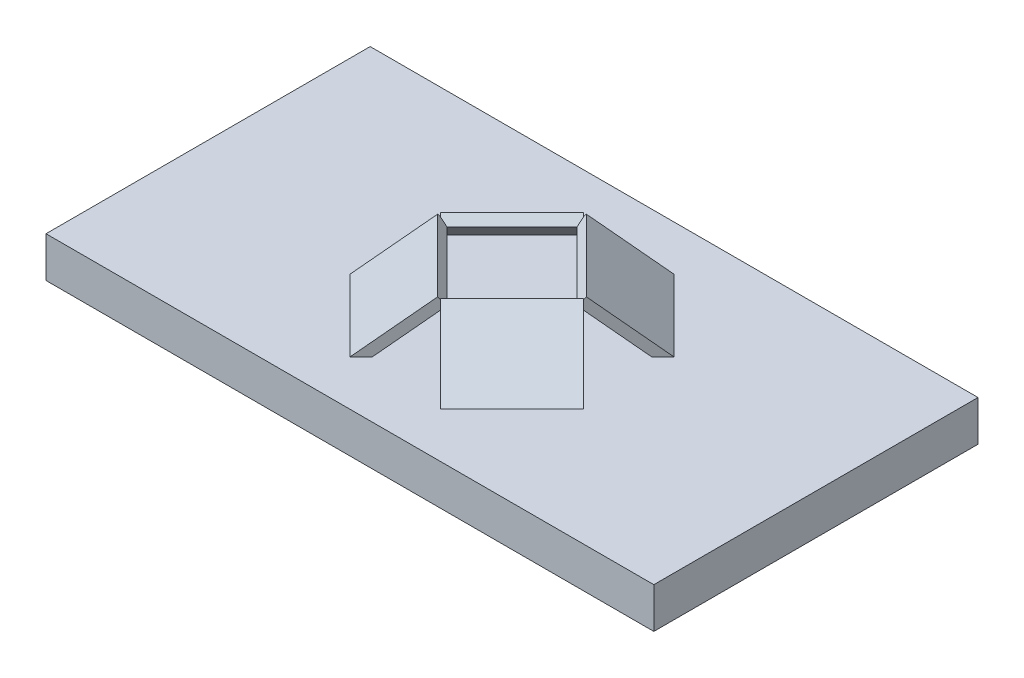
ISO-10303-21;
HEADER;
FILE_DESCRIPTION(('STEP AP214'),'2;1');
FILE_NAME('part.step','',(''),(''),'','','');
FILE_SCHEMA(('AUTOMOTIVE_DESIGN { 1 0 10303 214 1 1 1 1 }'));
ENDSEC;
DATA;
#1=APPLICATION_CONTEXT('core data for automotive mechanical design processes');
#2=APPLICATION_PROTOCOL_DEFINITION('international standard','automotive_design',2000,#1);
#3=PRODUCT_CONTEXT('',#1,'mechanical');
#4=PRODUCT('Part','Part','',(#3));
#5=PRODUCT_RELATED_PRODUCT_CATEGORY('part','',(#4));
#6=PRODUCT_DEFINITION_FORMATION('','',#4);
#7=PRODUCT_DEFINITION_CONTEXT('part definition',#1,'design');
#8=PRODUCT_DEFINITION('design','',#6,#7);
#9=PRODUCT_DEFINITION_SHAPE('','',#8);
#10=(LENGTH_UNIT() NAMED_UNIT(*) SI_UNIT(.MILLI.,.METRE.));
#11=(NAMED_UNIT(*) PLANE_ANGLE_UNIT() SI_UNIT($,.RADIAN.));
#12=(NAMED_UNIT(*) SI_UNIT($,.STERADIAN.) SOLID_ANGLE_UNIT());
#13=UNCERTAINTY_MEASURE_WITH_UNIT(LENGTH_MEASURE(1.E-05),#10,'distance_accuracy_value','');
#14=(GEOMETRIC_REPRESENTATION_CONTEXT(3) GLOBAL_UNCERTAINTY_ASSIGNED_CONTEXT((#13)) GLOBAL_UNIT_ASSIGNED_CONTEXT((#10,
#11,#12)) REPRESENTATION_CONTEXT('',''));
#15=CARTESIAN_POINT('',(0.,0.,0.));
#16=DIRECTION('',(0.,0.,1.));
#17=DIRECTION('',(1.,0.,0.));
#18=AXIS2_PLACEMENT_3D('',#15,#16,#17);
#19=CARTESIAN_POINT('',(0.,2.,0.));
#20=DIRECTION('',(0.,1.,0.));
#21=DIRECTION('',(0.,0.,1.));
#22=AXIS2_PLACEMENT_3D('',#19,#20,#21);
#23=PLANE('',#22);
#24=DIRECTION('',(1.,0.,0.));
#25=VECTOR('',#24,1.);
#26=CARTESIAN_POINT('',(-15.,2.,8.));
#27=LINE('',#26,#25);
#28=CARTESIAN_POINT('',(-15.,2.,8.));
#29=VERTEX_POINT('',#28);
#30=CARTESIAN_POINT('',(15.,2.,8.));
#31=VERTEX_POINT('',#30);
#32=EDGE_CURVE('E367',#29,#31,#27,.T.);
#33=ORIENTED_EDGE('',*,*,#32,.T.);
#34=DIRECTION('',(0.,0.,-1.));
#35=VECTOR('',#34,1.);
#36=CARTESIAN_POINT('',(15.,2.,8.));
#37=LINE('',#36,#35);
#38=CARTESIAN_POINT('',(15.,2.,-8.));
#39=VERTEX_POINT('',#38);
#40=EDGE_CURVE('E371',#31,#39,#37,.T.);
#41=ORIENTED_EDGE('',*,*,#40,.T.);
#42=DIRECTION('',(1.,0.,0.));
#43=VECTOR('',#42,1.);
#44=CARTESIAN_POINT('',(-15.,2.,-8.));
#45=LINE('',#44,#43);
#46=CARTESIAN_POINT('',(-15.,2.,-8.));
#47=VERTEX_POINT('',#46);
#48=EDGE_CURVE('E375',#47,#39,#45,.T.);
#49=ORIENTED_EDGE('',*,*,#48,.F.);
#50=DIRECTION('',(0.,0.,-1.));
#51=VECTOR('',#50,1.);
#52=CARTESIAN_POINT('',(-15.,2.,8.));
#53=LINE('',#52,#51);
#54=EDGE_CURVE('E379',#29,#47,#53,.T.);
#55=ORIENTED_EDGE('',*,*,#54,.F.);
#56=EDGE_LOOP('',(#33,#41,#49,#55));
#57=FACE_BOUND('',#56,.T.);
#58=DIRECTION('',(0.707106781186548,0.,0.707106781186547));
#59=VECTOR('',#58,1.);
#60=CARTESIAN_POINT('',(-3.44996856618676,2.,3.44996856618676));
#61=LINE('',#60,#59);
#62=CARTESIAN_POINT('',(-5.21773551915313,2.,1.68220161322039));
#63=VERTEX_POINT('',#62);
#64=CARTESIAN_POINT('',(-1.68220161322039,2.,5.21773551915313));
#65=VERTEX_POINT('',#64);
#66=EDGE_CURVE('E413',#63,#65,#61,.T.);
#67=ORIENTED_EDGE('',*,*,#66,.T.);
#68=DIRECTION('',(-0.707106781186547,0.,0.707106781186548));
#69=VECTOR('',#68,1.);
#70=CARTESIAN_POINT('',(1.76776695296637,2.,1.76776695296637));
#71=LINE('',#70,#69);
#72=CARTESIAN_POINT('',(-2.23223304703363,2.,5.76776695296637));
#73=VERTEX_POINT('',#72);
#74=EDGE_CURVE('E417',#65,#73,#71,.T.);
#75=ORIENTED_EDGE('',*,*,#74,.T.);
#76=DIRECTION('',(-0.707106781186548,0.,-0.707106781186547));
#77=VECTOR('',#76,1.);
#78=CARTESIAN_POINT('',(-2.23223304703363,2.,5.76776695296637));
#79=LINE('',#78,#77);
#80=CARTESIAN_POINT('',(-5.76776695296637,2.,2.23223304703363));
#81=VERTEX_POINT('',#80);
#82=EDGE_CURVE('E351',#73,#81,#79,.T.);
#83=ORIENTED_EDGE('',*,*,#82,.T.);
#84=DIRECTION('',(0.707106781186547,0.,-0.707106781186548));
#85=VECTOR('',#84,1.);
#86=CARTESIAN_POINT('',(-1.76776695296637,2.,-1.76776695296637));
#87=LINE('',#86,#85);
#88=EDGE_CURVE('E410',#81,#63,#87,.T.);
#89=ORIENTED_EDGE('',*,*,#88,.T.);
#90=EDGE_LOOP('',(#67,#75,#83,#89));
#91=FACE_BOUND('',#90,.T.);
#92=DIRECTION('',(0.70710678118654,0.,-0.707106781186555));
#93=VECTOR('',#92,1.);
#94=CARTESIAN_POINT('',(-5.7677669529664,2.,-2.23223304703357));
#95=LINE('',#94,#93);
#96=CARTESIAN_POINT('',(-5.7677669529664,2.,-2.23223304703357));
#97=VERTEX_POINT('',#96);
#98=CARTESIAN_POINT('',(-2.2322330470337,2.,-5.76776695296635));
#99=VERTEX_POINT('',#98);
#100=EDGE_CURVE('E194',#97,#99,#95,.T.);
#101=ORIENTED_EDGE('',*,*,#100,.T.);
#102=DIRECTION('',(0.707106781186555,0.,0.70710678118654));
#103=VECTOR('',#102,1.);
#104=CARTESIAN_POINT('',(1.76776695296635,2.,-1.76776695296639));
#105=LINE('',#104,#103);
#106=CARTESIAN_POINT('',(-1.68220161322045,2.,-5.21773551915311));
#107=VERTEX_POINT('',#106);
#108=EDGE_CURVE('E436',#99,#107,#105,.T.);
#109=ORIENTED_EDGE('',*,*,#108,.T.);
#110=DIRECTION('',(-0.70710678118654,0.,0.707106781186555));
#111=VECTOR('',#110,1.);
#112=CARTESIAN_POINT('',(-3.4499685661868,2.,-3.44996856618672));
#113=LINE('',#112,#111);
#114=CARTESIAN_POINT('',(-5.21773551915315,2.,-1.68220161322034));
#115=VERTEX_POINT('',#114);
#116=EDGE_CURVE('E197',#107,#115,#113,.T.);
#117=ORIENTED_EDGE('',*,*,#116,.T.);
#118=DIRECTION('',(-0.707106781186555,0.,-0.70710678118654));
#119=VECTOR('',#118,1.);
#120=CARTESIAN_POINT('',(-1.76776695296635,2.,1.76776695296639));
#121=LINE('',#120,#119);
#122=EDGE_CURVE('E191',#115,#97,#121,.T.);
#123=ORIENTED_EDGE('',*,*,#122,.T.);
#124=EDGE_LOOP('',(#101,#109,#117,#123));
#125=FACE_BOUND('',#124,.T.);
#126=DIRECTION('',(-0.707106781186547,0.,0.707106781186548));
#127=VECTOR('',#126,1.);
#128=CARTESIAN_POINT('',(1.76776695296637,2.,1.76776695296637));
#129=LINE('',#128,#127);
#130=CARTESIAN_POINT('',(5.76776695296637,2.,-2.23223304703363));
#131=VERTEX_POINT('',#130);
#132=CARTESIAN_POINT('',(5.21773551915313,2.,-1.68220161322039));
#133=VERTEX_POINT('',#132);
#134=EDGE_CURVE('E442',#131,#133,#129,.T.);
#135=ORIENTED_EDGE('',*,*,#134,.T.);
#136=DIRECTION('',(-0.707106781186548,0.,-0.707106781186547));
#137=VECTOR('',#136,1.);
#138=CARTESIAN_POINT('',(3.44996856618676,2.,-3.44996856618676));
#139=LINE('',#138,#137);
#140=CARTESIAN_POINT('',(1.68220161322039,2.,-5.21773551915313));
#141=VERTEX_POINT('',#140);
#142=EDGE_CURVE('E54',#133,#141,#139,.T.);
#143=ORIENTED_EDGE('',*,*,#142,.T.);
#144=DIRECTION('',(0.707106781186547,0.,-0.707106781186548));
#145=VECTOR('',#144,1.);
#146=CARTESIAN_POINT('',(-1.76776695296637,2.,-1.76776695296637));
#147=LINE('',#146,#145);
#148=CARTESIAN_POINT('',(2.23223304703363,2.,-5.76776695296637));
#149=VERTEX_POINT('',#148);
#150=EDGE_CURVE('E439',#141,#149,#147,.T.);
#151=ORIENTED_EDGE('',*,*,#150,.T.);
#152=DIRECTION('',(0.707106781186548,0.,0.707106781186547));
#153=VECTOR('',#152,1.);
#154=CARTESIAN_POINT('',(2.23223304703363,2.,-5.76776695296637));
#155=LINE('',#154,#153);
#156=EDGE_CURVE('E257',#149,#131,#155,.T.);
#157=ORIENTED_EDGE('',*,*,#156,.T.);
#158=EDGE_LOOP('',(#135,#143,#151,#157));
#159=FACE_BOUND('',#158,.T.);
#160=DIRECTION('',(0.707106781186545,0.,-0.70710678118655));
#161=VECTOR('',#160,1.);
#162=CARTESIAN_POINT('',(3.44996856618678,2.,3.44996856618675));
#163=LINE('',#162,#161);
#164=CARTESIAN_POINT('',(1.68220161322041,2.,5.21773551915313));
#165=VERTEX_POINT('',#164);
#166=CARTESIAN_POINT('',(5.21773551915314,2.,1.68220161322037));
#167=VERTEX_POINT('',#166);
#168=EDGE_CURVE('E60',#165,#167,#163,.T.);
#169=ORIENTED_EDGE('',*,*,#168,.T.);
#170=DIRECTION('',(0.707106781186551,0.,0.707106781186545));
#171=VECTOR('',#170,1.);
#172=CARTESIAN_POINT('',(1.76776695296636,2.,-1.76776695296638));
#173=LINE('',#172,#171);
#174=CARTESIAN_POINT('',(5.76776695296638,2.,2.23223304703361));
#175=VERTEX_POINT('',#174);
#176=EDGE_CURVE('E11',#167,#175,#173,.T.);
#177=ORIENTED_EDGE('',*,*,#176,.T.);
#178=DIRECTION('',(-0.707106781186545,0.,0.70710678118655));
#179=VECTOR('',#178,1.);
#180=CARTESIAN_POINT('',(5.76776695296638,2.,2.23223304703361));
#181=LINE('',#180,#179);
#182=CARTESIAN_POINT('',(2.23223304703365,2.,5.76776695296636));
#183=VERTEX_POINT('',#182);
#184=EDGE_CURVE('E301',#175,#183,#181,.T.);
#185=ORIENTED_EDGE('',*,*,#184,.T.);
#186=DIRECTION('',(-0.70710678118655,0.,-0.707106781186545));
#187=VECTOR('',#186,1.);
#188=CARTESIAN_POINT('',(-1.76776695296636,2.,1.76776695296637));
#189=LINE('',#188,#187);
#190=EDGE_CURVE('E65',#183,#165,#189,.T.);
#191=ORIENTED_EDGE('',*,*,#190,.T.);
#192=EDGE_LOOP('',(#169,#177,#185,#191));
#193=FACE_BOUND('',#192,.T.);
#194=ADVANCED_FACE('F45',(#57,#91,#125,#159,#193),#23,.T.);
#195=CARTESIAN_POINT('',(-2.00497330819761,1.61697777844051,5.54050721413035));
#196=DIRECTION('',(-0.707106781186548,0.,-0.707106781186547));
#197=DIRECTION('',(-0.707106781186547,0.,0.707106781186548));
#198=AXIS2_PLACEMENT_3D('',#195,#196,#197);
#199=PLANE('',#198);
#200=DIRECTION('',(0.,-1.,0.));
#201=VECTOR('',#200,1.);
#202=CARTESIAN_POINT('',(0.,1.61697777844051,3.53553390593273));
#203=LINE('',#202,#201);
#204=CARTESIAN_POINT('',(0.,4.46070291431279,3.53553390593273));
#205=VERTEX_POINT('',#204);
#206=CARTESIAN_POINT('',(0.,3.99621159176338,3.53553390593273));
#207=VERTEX_POINT('',#206);
#208=EDGE_CURVE('E328',#205,#207,#203,.T.);
#209=ORIENTED_EDGE('',*,*,#208,.F.);
#210=DIRECTION('',(-0.454519477672046,0.766044443118975,0.454519477672047));
#211=VECTOR('',#210,1.);
#212=CARTESIAN_POINT('',(0.16172757348119,4.18812821718668,3.37380633245155));
#213=LINE('',#212,#211);
#214=CARTESIAN_POINT('',(-0.0655321653548328,4.57115043874617,3.60106607128757));
#215=VERTEX_POINT('',#214);
#216=EDGE_CURVE('E347',#205,#215,#213,.T.);
#217=ORIENTED_EDGE('',*,*,#216,.T.);
#218=DIRECTION('',(-0.541675220419699,-0.642787609686543,0.5416752204197));
#219=VECTOR('',#218,1.);
#220=CARTESIAN_POINT('',(-2.23223304703363,2.,5.76776695296637));
#221=LINE('',#220,#219);
#222=EDGE_CURVE('E336',#215,#73,#221,.T.);
#223=ORIENTED_EDGE('',*,*,#222,.T.);
#224=ORIENTED_EDGE('',*,*,#74,.F.);
#225=DIRECTION('',(-0.541675220419699,-0.642787609686543,0.5416752204197));
#226=VECTOR('',#225,1.);
#227=CARTESIAN_POINT('',(-2.00497330819761,1.61697777844051,5.54050721413035));
#228=LINE('',#227,#226);
#229=EDGE_CURVE('E337',#207,#65,#228,.T.);
#230=ORIENTED_EDGE('',*,*,#229,.F.);
#231=EDGE_LOOP('',(#209,#217,#223,#224,#230));
#232=FACE_BOUND('',#231,.T.);
#233=ADVANCED_FACE('F519',(#232),#199,.F.);
#234=CARTESIAN_POINT('',(-5.54050721413035,1.61697777844051,2.00497330819761));
#235=DIRECTION('',(0.707106781186548,0.,0.707106781186547));
#236=DIRECTION('',(0.707106781186547,0.,-0.707106781186548));
#237=AXIS2_PLACEMENT_3D('',#234,#235,#236);
#238=PLANE('',#237);
#239=DIRECTION('',(0.,1.,0.));
#240=VECTOR('',#239,1.);
#241=CARTESIAN_POINT('',(-3.53553390593276,1.61697777844051,0.));
#242=LINE('',#241,#240);
#243=CARTESIAN_POINT('',(-3.53553390593276,3.99621159176335,0.));
#244=VERTEX_POINT('',#243);
#245=CARTESIAN_POINT('',(-3.53553390593276,4.46070291431283,0.));
#246=VERTEX_POINT('',#245);
#247=EDGE_CURVE('E203',#244,#246,#242,.T.);
#248=ORIENTED_EDGE('',*,*,#247,.F.);
#249=DIRECTION('',(0.5416752204197,0.642787609686543,-0.541675220419699));
#250=VECTOR('',#249,1.);
#251=CARTESIAN_POINT('',(-5.54050721413035,1.61697777844051,2.00497330819761));
#252=LINE('',#251,#250);
#253=EDGE_CURVE('E340',#63,#244,#252,.T.);
#254=ORIENTED_EDGE('',*,*,#253,.F.);
#255=ORIENTED_EDGE('',*,*,#88,.F.);
#256=DIRECTION('',(0.5416752204197,0.642787609686543,-0.541675220419699));
#257=VECTOR('',#256,1.);
#258=CARTESIAN_POINT('',(-5.76776695296637,2.,2.23223304703364));
#259=LINE('',#258,#257);
#260=CARTESIAN_POINT('',(-3.60106607128757,4.57115043874617,0.0655321653548376));
#261=VERTEX_POINT('',#260);
#262=EDGE_CURVE('E354',#81,#261,#259,.T.);
#263=ORIENTED_EDGE('',*,*,#262,.T.);
#264=DIRECTION('',(-0.454519477672046,0.766044443118975,0.454519477672047));
#265=VECTOR('',#264,1.);
#266=CARTESIAN_POINT('',(-3.37380633245155,4.18812821718668,-0.161727573481186));
#267=LINE('',#266,#265);
#268=EDGE_CURVE('E363',#246,#261,#267,.T.);
#269=ORIENTED_EDGE('',*,*,#268,.F.);
#270=EDGE_LOOP('',(#248,#254,#255,#263,#269));
#271=FACE_BOUND('',#270,.T.);
#272=ADVANCED_FACE('F527',(#271),#238,.F.);
#273=CARTESIAN_POINT('',(0.16172757348119,4.18812821718668,3.37380633245155));
#274=DIRECTION('',(-0.541675220419699,-0.642787609686543,0.5416752204197));
#275=DIRECTION('',(0.,-0.644400477571768,-0.764688187763664));
#276=AXIS2_PLACEMENT_3D('',#273,#274,#275);
#277=PLANE('',#276);
#278=DIRECTION('',(0.,0.644400477571767,0.764688187763665));
#279=VECTOR('',#278,1.);
#280=CARTESIAN_POINT('',(0.,4.26782197502399,3.30664863807152));
#281=LINE('',#280,#279);
#282=CARTESIAN_POINT('',(0.,4.18812821718668,3.21207875897037));
#283=VERTEX_POINT('',#282);
#284=EDGE_CURVE('E432',#283,#205,#281,.T.);
#285=ORIENTED_EDGE('',*,*,#284,.F.);
#286=DIRECTION('',(0.707106781186548,0.,0.707106781186547));
#287=VECTOR('',#286,1.);
#288=CARTESIAN_POINT('',(0.16172757348119,4.18812821718668,3.37380633245155));
#289=LINE('',#288,#287);
#290=CARTESIAN_POINT('',(-3.21207875897035,4.18812821718668,0.));
#291=VERTEX_POINT('',#290);
#292=EDGE_CURVE('E344',#291,#283,#289,.T.);
#293=ORIENTED_EDGE('',*,*,#292,.F.);
#294=DIRECTION('',(0.764688187763663,-0.64440047757177,0.));
#295=VECTOR('',#294,1.);
#296=CARTESIAN_POINT('',(-1.23925217100593,2.5256330776077,0.));
#297=LINE('',#296,#295);
#298=EDGE_CURVE('E428',#246,#291,#297,.T.);
#299=ORIENTED_EDGE('',*,*,#298,.F.);
#300=ORIENTED_EDGE('',*,*,#268,.T.);
#301=DIRECTION('',(0.707106781186548,0.,0.707106781186547));
#302=VECTOR('',#301,1.);
#303=CARTESIAN_POINT('',(-0.0655321653548328,4.57115043874617,3.60106607128757));
#304=LINE('',#303,#302);
#305=EDGE_CURVE('E341',#261,#215,#304,.T.);
#306=ORIENTED_EDGE('',*,*,#305,.T.);
#307=ORIENTED_EDGE('',*,*,#216,.F.);
#308=EDGE_LOOP('',(#285,#293,#299,#300,#306,#307));
#309=FACE_BOUND('',#308,.T.);
#310=ADVANCED_FACE('F515',(#309),#277,.F.);
#311=CARTESIAN_POINT('',(-2.12180814615016,3.57608291738751,2.12180814615016));
#312=DIRECTION('',(-0.454519477672046,0.766044443118975,0.454519477672047));
#313=DIRECTION('',(0.,-0.510273605374741,0.860012120645903));
#314=AXIS2_PLACEMENT_3D('',#311,#312,#313);
#315=PLANE('',#314);
#316=DIRECTION('',(0.,0.51027360537474,-0.860012120645903));
#317=VECTOR('',#316,1.);
#318=CARTESIAN_POINT('',(0.,4.50722035612208,2.67428275267737));
#319=LINE('',#318,#317);
#320=EDGE_CURVE('E424',#207,#283,#319,.T.);
#321=ORIENTED_EDGE('',*,*,#320,.F.);
#322=ORIENTED_EDGE('',*,*,#229,.T.);
#323=ORIENTED_EDGE('',*,*,#66,.F.);
#324=ORIENTED_EDGE('',*,*,#253,.T.);
#325=DIRECTION('',(-0.860012120645902,-0.510273605374743,0.));
#326=VECTOR('',#325,1.);
#327=CARTESIAN_POINT('',(-2.67428275267738,4.50722035612206,0.));
#328=LINE('',#327,#326);
#329=EDGE_CURVE('E420',#291,#244,#328,.T.);
#330=ORIENTED_EDGE('',*,*,#329,.F.);
#331=ORIENTED_EDGE('',*,*,#292,.T.);
#332=EDGE_LOOP('',(#321,#322,#323,#324,#330,#331));
#333=FACE_BOUND('',#332,.T.);
#334=ADVANCED_FACE('F522',(#333),#315,.F.);
#335=CARTESIAN_POINT('',(-15.,2.,8.));
#336=DIRECTION('',(0.,0.,-1.));
#337=DIRECTION('',(-1.,0.,0.));
#338=AXIS2_PLACEMENT_3D('',#335,#336,#337);
#339=PLANE('',#338);
#340=DIRECTION('',(1.,0.,0.));
#341=VECTOR('',#340,1.);
#342=CARTESIAN_POINT('',(-15.,0.,8.));
#343=LINE('',#342,#341);
#344=CARTESIAN_POINT('',(-15.,0.,8.));
#345=VERTEX_POINT('',#344);
#346=CARTESIAN_POINT('',(15.,0.,8.));
#347=VERTEX_POINT('',#346);
#348=EDGE_CURVE('E366',#345,#347,#343,.T.);
#349=ORIENTED_EDGE('',*,*,#348,.T.);
#350=DIRECTION('',(0.,-1.,0.));
#351=VECTOR('',#350,1.);
#352=CARTESIAN_POINT('',(15.,2.,8.));
#353=LINE('',#352,#351);
#354=EDGE_CURVE('E406',#31,#347,#353,.T.);
#355=ORIENTED_EDGE('',*,*,#354,.F.);
#356=ORIENTED_EDGE('',*,*,#32,.F.);
#357=DIRECTION('',(0.,-1.,0.));
#358=VECTOR('',#357,1.);
#359=CARTESIAN_POINT('',(-15.,2.,8.));
#360=LINE('',#359,#358);
#361=EDGE_CURVE('E383',#29,#345,#360,.T.);
#362=ORIENTED_EDGE('',*,*,#361,.T.);
#363=EDGE_LOOP('',(#349,#355,#356,#362));
#364=FACE_BOUND('',#363,.T.);
#365=ADVANCED_FACE('F47',(#364),#339,.F.);
#366=CARTESIAN_POINT('',(15.,2.,8.));
#367=DIRECTION('',(-1.,0.,0.));
#368=DIRECTION('',(0.,0.,1.));
#369=AXIS2_PLACEMENT_3D('',#366,#367,#368);
#370=PLANE('',#369);
#371=DIRECTION('',(0.,0.,-1.));
#372=VECTOR('',#371,1.);
#373=CARTESIAN_POINT('',(15.,0.,8.));
#374=LINE('',#373,#372);
#375=CARTESIAN_POINT('',(15.,0.,-8.));
#376=VERTEX_POINT('',#375);
#377=EDGE_CURVE('E387',#347,#376,#374,.T.);
#378=ORIENTED_EDGE('',*,*,#377,.T.);
#379=DIRECTION('',(0.,-1.,0.));
#380=VECTOR('',#379,1.);
#381=CARTESIAN_POINT('',(15.,2.,-8.));
#382=LINE('',#381,#380);
#383=EDGE_CURVE('E403',#39,#376,#382,.T.);
#384=ORIENTED_EDGE('',*,*,#383,.F.);
#385=ORIENTED_EDGE('',*,*,#40,.F.);
#386=ORIENTED_EDGE('',*,*,#354,.T.);
#387=EDGE_LOOP('',(#378,#384,#385,#386));
#388=FACE_BOUND('',#387,.T.);
#389=ADVANCED_FACE('F557',(#388),#370,.F.);
#390=CARTESIAN_POINT('',(-15.,2.,-8.));
#391=DIRECTION('',(0.,0.,-1.));
#392=DIRECTION('',(-1.,0.,0.));
#393=AXIS2_PLACEMENT_3D('',#390,#391,#392);
#394=PLANE('',#393);
#395=DIRECTION('',(1.,0.,0.));
#396=VECTOR('',#395,1.);
#397=CARTESIAN_POINT('',(-15.,0.,-8.));
#398=LINE('',#397,#396);
#399=CARTESIAN_POINT('',(-15.,0.,-8.));
#400=VERTEX_POINT('',#399);
#401=EDGE_CURVE('E391',#400,#376,#398,.T.);
#402=ORIENTED_EDGE('',*,*,#401,.F.);
#403=DIRECTION('',(0.,-1.,0.));
#404=VECTOR('',#403,1.);
#405=CARTESIAN_POINT('',(-15.,2.,-8.));
#406=LINE('',#405,#404);
#407=EDGE_CURVE('E400',#47,#400,#406,.T.);
#408=ORIENTED_EDGE('',*,*,#407,.F.);
#409=ORIENTED_EDGE('',*,*,#48,.T.);
#410=ORIENTED_EDGE('',*,*,#383,.T.);
#411=EDGE_LOOP('',(#402,#408,#409,#410));
#412=FACE_BOUND('',#411,.T.);
#413=ADVANCED_FACE('F554',(#412),#394,.T.);
#414=CARTESIAN_POINT('',(-15.,2.,8.));
#415=DIRECTION('',(-1.,0.,0.));
#416=DIRECTION('',(0.,0.,1.));
#417=AXIS2_PLACEMENT_3D('',#414,#415,#416);
#418=PLANE('',#417);
#419=DIRECTION('',(0.,0.,-1.));
#420=VECTOR('',#419,1.);
#421=CARTESIAN_POINT('',(-15.,0.,8.));
#422=LINE('',#421,#420);
#423=EDGE_CURVE('E372',#345,#400,#422,.T.);
#424=ORIENTED_EDGE('',*,*,#423,.F.);
#425=ORIENTED_EDGE('',*,*,#361,.F.);
#426=ORIENTED_EDGE('',*,*,#54,.T.);
#427=ORIENTED_EDGE('',*,*,#407,.T.);
#428=EDGE_LOOP('',(#424,#425,#426,#427));
#429=FACE_BOUND('',#428,.T.);
#430=ADVANCED_FACE('F539',(#429),#418,.T.);
#431=CARTESIAN_POINT('',(0.,0.,0.));
#432=DIRECTION('',(0.,1.,0.));
#433=DIRECTION('',(0.,0.,1.));
#434=AXIS2_PLACEMENT_3D('',#431,#432,#433);
#435=PLANE('',#434);
#436=ORIENTED_EDGE('',*,*,#348,.F.);
#437=ORIENTED_EDGE('',*,*,#423,.T.);
#438=ORIENTED_EDGE('',*,*,#401,.T.);
#439=ORIENTED_EDGE('',*,*,#377,.F.);
#440=EDGE_LOOP('',(#436,#437,#438,#439));
#441=FACE_BOUND('',#440,.T.);
#442=ADVANCED_FACE('F531',(#441),#435,.F.);
#443=CARTESIAN_POINT('',(-2.34906788498618,3.959105138947,2.34906788498618));
#444=DIRECTION('',(-0.454519477672046,0.766044443118975,0.454519477672047));
#445=DIRECTION('',(0.,-0.510273605374741,0.860012120645903));
#446=AXIS2_PLACEMENT_3D('',#443,#444,#445);
#447=PLANE('',#446);
#448=ORIENTED_EDGE('',*,*,#222,.F.);
#449=ORIENTED_EDGE('',*,*,#305,.F.);
#450=ORIENTED_EDGE('',*,*,#262,.F.);
#451=ORIENTED_EDGE('',*,*,#82,.F.);
#452=EDGE_LOOP('',(#448,#449,#450,#451));
#453=FACE_BOUND('',#452,.T.);
#454=ADVANCED_FACE('F529',(#453),#447,.T.);
#455=CARTESIAN_POINT('',(3.37380633245155,4.18812821718668,-0.161727573481202));
#456=DIRECTION('',(0.541675220419702,-0.642787609686543,0.541675220419697));
#457=DIRECTION('',(0.764688187763663,0.644400477571769,0.));
#458=AXIS2_PLACEMENT_3D('',#455,#456,#457);
#459=PLANE('',#458);
#460=DIRECTION('',(0.707106781186545,0.,-0.70710678118655));
#461=VECTOR('',#460,1.);
#462=CARTESIAN_POINT('',(3.37380633245155,4.18812821718668,-0.161727573481202));
#463=LINE('',#462,#461);
#464=CARTESIAN_POINT('',(3.21207875897036,4.18812821718668,0.));
#465=VERTEX_POINT('',#464);
#466=EDGE_CURVE('E294',#283,#465,#463,.T.);
#467=ORIENTED_EDGE('',*,*,#466,.F.);
#468=ORIENTED_EDGE('',*,*,#284,.T.);
#469=DIRECTION('',(0.454519477672048,0.766044443118975,0.454519477672045));
#470=VECTOR('',#469,1.);
#471=CARTESIAN_POINT('',(-0.161727573481174,4.18812821718668,3.37380633245155));
#472=LINE('',#471,#470);
#473=CARTESIAN_POINT('',(0.0655321653548501,4.57115043874617,3.60106607128757));
#474=VERTEX_POINT('',#473);
#475=EDGE_CURVE('E313',#205,#474,#472,.T.);
#476=ORIENTED_EDGE('',*,*,#475,.T.);
#477=DIRECTION('',(0.707106781186545,0.,-0.70710678118655));
#478=VECTOR('',#477,1.);
#479=CARTESIAN_POINT('',(3.60106607128757,4.57115043874617,0.0655321653548202));
#480=LINE('',#479,#478);
#481=CARTESIAN_POINT('',(3.60106607128757,4.57115043874617,0.0655321653548202));
#482=VERTEX_POINT('',#481);
#483=EDGE_CURVE('E290',#474,#482,#480,.T.);
#484=ORIENTED_EDGE('',*,*,#483,.T.);
#485=DIRECTION('',(0.454519477672048,0.766044443118975,0.454519477672045));
#486=VECTOR('',#485,1.);
#487=CARTESIAN_POINT('',(3.37380633245155,4.18812821718668,-0.161727573481202));
#488=LINE('',#487,#486);
#489=CARTESIAN_POINT('',(3.53553390593274,4.46070291431281,0.));
#490=VERTEX_POINT('',#489);
#491=EDGE_CURVE('E297',#490,#482,#488,.T.);
#492=ORIENTED_EDGE('',*,*,#491,.F.);
#493=DIRECTION('',(0.764688187763664,0.644400477571769,0.));
#494=VECTOR('',#493,1.);
#495=CARTESIAN_POINT('',(3.30664863807152,4.267821975024,0.));
#496=LINE('',#495,#494);
#497=EDGE_CURVE('E320',#465,#490,#496,.T.);
#498=ORIENTED_EDGE('',*,*,#497,.F.);
#499=EDGE_LOOP('',(#467,#468,#476,#484,#492,#498));
#500=FACE_BOUND('',#499,.T.);
#501=ADVANCED_FACE('F510',(#500),#459,.F.);
#502=CARTESIAN_POINT('',(-3.37380633245155,4.18812821718668,0.161727573481226));
#503=DIRECTION('',(-0.541675220419706,-0.642787609686543,-0.541675220419694));
#504=DIRECTION('',(0.764688187763661,-0.644400477571772,0.));
#505=AXIS2_PLACEMENT_3D('',#502,#503,#504);
#506=PLANE('',#505);
#507=DIRECTION('',(-0.454519477672052,0.766044443118975,-0.454519477672041));
#508=VECTOR('',#507,1.);
#509=CARTESIAN_POINT('',(-3.37380633245155,4.18812821718668,0.161727573481226));
#510=LINE('',#509,#508);
#511=CARTESIAN_POINT('',(-3.60106607128757,4.57115043874617,-0.0655321653547951));
#512=VERTEX_POINT('',#511);
#513=EDGE_CURVE('E218',#246,#512,#510,.T.);
#514=ORIENTED_EDGE('',*,*,#513,.F.);
#515=ORIENTED_EDGE('',*,*,#298,.T.);
#516=DIRECTION('',(-0.70710678118654,0.,0.707106781186555));
#517=VECTOR('',#516,1.);
#518=CARTESIAN_POINT('',(-3.37380633245155,4.18812821718668,0.161727573481226));
#519=LINE('',#518,#517);
#520=CARTESIAN_POINT('',(0.,4.18812821718668,-3.21207875897038));
#521=VERTEX_POINT('',#520);
#522=EDGE_CURVE('E223',#521,#291,#519,.T.);
#523=ORIENTED_EDGE('',*,*,#522,.F.);
#524=DIRECTION('',(0.,0.644400477571766,-0.764688187763666));
#525=VECTOR('',#524,1.);
#526=CARTESIAN_POINT('',(0.,4.26782197502399,-3.30664863807153));
#527=LINE('',#526,#525);
#528=CARTESIAN_POINT('',(0.,4.46070291431277,-3.53553390593272));
#529=VERTEX_POINT('',#528);
#530=EDGE_CURVE('E276',#521,#529,#527,.T.);
#531=ORIENTED_EDGE('',*,*,#530,.T.);
#532=DIRECTION('',(-0.454519477672052,0.766044443118975,-0.454519477672041));
#533=VECTOR('',#532,1.);
#534=CARTESIAN_POINT('',(0.16172757348115,4.18812821718668,-3.37380633245155));
#535=LINE('',#534,#533);
#536=CARTESIAN_POINT('',(-0.0655321653548753,4.57115043874617,-3.60106607128757));
#537=VERTEX_POINT('',#536);
#538=EDGE_CURVE('E234',#529,#537,#535,.T.);
#539=ORIENTED_EDGE('',*,*,#538,.T.);
#540=DIRECTION('',(-0.70710678118654,0.,0.707106781186555));
#541=VECTOR('',#540,1.);
#542=CARTESIAN_POINT('',(-3.60106607128757,4.57115043874617,-0.0655321653547951));
#543=LINE('',#542,#541);
#544=EDGE_CURVE('E228',#537,#512,#543,.T.);
#545=ORIENTED_EDGE('',*,*,#544,.T.);
#546=EDGE_LOOP('',(#514,#515,#523,#531,#539,#545));
#547=FACE_BOUND('',#546,.T.);
#548=ADVANCED_FACE('F466',(#547),#506,.F.);
#549=CARTESIAN_POINT('',(2.12180814615017,3.57608291738751,2.12180814615015));
#550=DIRECTION('',(0.454519477672048,0.766044443118975,0.454519477672045));
#551=DIRECTION('',(0.860012120645903,-0.510273605374741,0.));
#552=AXIS2_PLACEMENT_3D('',#549,#550,#551);
#553=PLANE('',#552);
#554=ORIENTED_EDGE('',*,*,#168,.F.);
#555=DIRECTION('',(-0.541675220419701,0.642787609686543,-0.541675220419698));
#556=VECTOR('',#555,1.);
#557=CARTESIAN_POINT('',(2.00497330819763,1.61697777844051,5.54050721413034));
#558=LINE('',#557,#556);
#559=EDGE_CURVE('E289',#165,#207,#558,.T.);
#560=ORIENTED_EDGE('',*,*,#559,.T.);
#561=ORIENTED_EDGE('',*,*,#320,.T.);
#562=ORIENTED_EDGE('',*,*,#466,.T.);
#563=DIRECTION('',(-0.860012120645903,0.510273605374741,0.));
#564=VECTOR('',#563,1.);
#565=CARTESIAN_POINT('',(2.67428275267738,4.50722035612207,0.));
#566=LINE('',#565,#564);
#567=CARTESIAN_POINT('',(3.53553390593274,3.99621159176337,0.));
#568=VERTEX_POINT('',#567);
#569=EDGE_CURVE('E316',#568,#465,#566,.T.);
#570=ORIENTED_EDGE('',*,*,#569,.F.);
#571=DIRECTION('',(0.541675220419702,-0.642787609686543,0.541675220419697));
#572=VECTOR('',#571,1.);
#573=CARTESIAN_POINT('',(5.54050721413036,1.61697777844051,2.00497330819759));
#574=LINE('',#573,#572);
#575=EDGE_CURVE('E285',#568,#167,#574,.T.);
#576=ORIENTED_EDGE('',*,*,#575,.T.);
#577=EDGE_LOOP('',(#554,#560,#561,#562,#570,#576));
#578=FACE_BOUND('',#577,.T.);
#579=ADVANCED_FACE('F491',(#578),#553,.F.);
#580=CARTESIAN_POINT('',(2.00497330819763,1.61697777844051,5.54050721413034));
#581=DIRECTION('',(0.707106781186545,0.,-0.70710678118655));
#582=DIRECTION('',(-0.70710678118655,0.,-0.707106781186545));
#583=AXIS2_PLACEMENT_3D('',#580,#581,#582);
#584=PLANE('',#583);
#585=ORIENTED_EDGE('',*,*,#190,.F.);
#586=DIRECTION('',(-0.541675220419701,0.642787609686543,-0.541675220419698));
#587=VECTOR('',#586,1.);
#588=CARTESIAN_POINT('',(2.23223304703366,2.,5.76776695296636));
#589=LINE('',#588,#587);
#590=EDGE_CURVE('E304',#183,#474,#589,.T.);
#591=ORIENTED_EDGE('',*,*,#590,.T.);
#592=ORIENTED_EDGE('',*,*,#475,.F.);
#593=ORIENTED_EDGE('',*,*,#208,.T.);
#594=ORIENTED_EDGE('',*,*,#559,.F.);
#595=EDGE_LOOP('',(#585,#591,#592,#593,#594));
#596=FACE_BOUND('',#595,.T.);
#597=ADVANCED_FACE('F505',(#596),#584,.F.);
#598=CARTESIAN_POINT('',(-2.12180814615018,3.57608291738751,-2.12180814615013));
#599=DIRECTION('',(-0.454519477672051,0.766044443118975,-0.454519477672041));
#600=DIRECTION('',(-0.860012120645903,-0.510273605374741,0.));
#601=AXIS2_PLACEMENT_3D('',#598,#599,#600);
#602=PLANE('',#601);
#603=ORIENTED_EDGE('',*,*,#116,.F.);
#604=DIRECTION('',(0.541675220419705,0.642787609686543,0.541675220419694));
#605=VECTOR('',#604,1.);
#606=CARTESIAN_POINT('',(-2.00497330819767,1.61697777844051,-5.54050721413033));
#607=LINE('',#606,#605);
#608=CARTESIAN_POINT('',(0.,3.99621159176339,-3.53553390593272));
#609=VERTEX_POINT('',#608);
#610=EDGE_CURVE('E464',#107,#609,#607,.T.);
#611=ORIENTED_EDGE('',*,*,#610,.T.);
#612=DIRECTION('',(0.,0.510273605374739,0.860012120645904));
#613=VECTOR('',#612,1.);
#614=CARTESIAN_POINT('',(0.,4.50722035612208,-2.67428275267737));
#615=LINE('',#614,#613);
#616=EDGE_CURVE('E272',#609,#521,#615,.T.);
#617=ORIENTED_EDGE('',*,*,#616,.T.);
#618=ORIENTED_EDGE('',*,*,#522,.T.);
#619=ORIENTED_EDGE('',*,*,#329,.T.);
#620=DIRECTION('',(-0.541675220419706,-0.642787609686543,-0.541675220419693));
#621=VECTOR('',#620,1.);
#622=CARTESIAN_POINT('',(-5.54050721413037,1.61697777844051,-2.00497330819755));
#623=LINE('',#622,#621);
#624=EDGE_CURVE('E231',#244,#115,#623,.T.);
#625=ORIENTED_EDGE('',*,*,#624,.T.);
#626=EDGE_LOOP('',(#603,#611,#617,#618,#619,#625));
#627=FACE_BOUND('',#626,.T.);
#628=ADVANCED_FACE('F462',(#627),#602,.F.);
#629=CARTESIAN_POINT('',(-5.54050721413037,1.61697777844051,-2.00497330819755));
#630=DIRECTION('',(0.70710678118654,0.,-0.707106781186555));
#631=DIRECTION('',(-0.707106781186555,0.,-0.70710678118654));
#632=AXIS2_PLACEMENT_3D('',#629,#630,#631);
#633=PLANE('',#632);
#634=ORIENTED_EDGE('',*,*,#122,.F.);
#635=ORIENTED_EDGE('',*,*,#624,.F.);
#636=ORIENTED_EDGE('',*,*,#247,.T.);
#637=ORIENTED_EDGE('',*,*,#513,.T.);
#638=DIRECTION('',(-0.541675220419706,-0.642787609686543,-0.541675220419693));
#639=VECTOR('',#638,1.);
#640=CARTESIAN_POINT('',(-5.7677669529664,2.,-2.23223304703357));
#641=LINE('',#640,#639);
#642=EDGE_CURVE('E210',#512,#97,#641,.T.);
#643=ORIENTED_EDGE('',*,*,#642,.T.);
#644=EDGE_LOOP('',(#634,#635,#636,#637,#643));
#645=FACE_BOUND('',#644,.T.);
#646=ADVANCED_FACE('F215',(#645),#633,.F.);
#647=CARTESIAN_POINT('',(5.54050721413036,1.61697777844051,2.00497330819759));
#648=DIRECTION('',(-0.707106781186545,0.,0.707106781186551));
#649=DIRECTION('',(0.707106781186551,0.,0.707106781186545));
#650=AXIS2_PLACEMENT_3D('',#647,#648,#649);
#651=PLANE('',#650);
#652=ORIENTED_EDGE('',*,*,#176,.F.);
#653=ORIENTED_EDGE('',*,*,#575,.F.);
#654=DIRECTION('',(0.,-1.,0.));
#655=VECTOR('',#654,1.);
#656=CARTESIAN_POINT('',(3.53553390593274,1.61697777844051,0.));
#657=LINE('',#656,#655);
#658=EDGE_CURVE('E280',#490,#568,#657,.T.);
#659=ORIENTED_EDGE('',*,*,#658,.F.);
#660=ORIENTED_EDGE('',*,*,#491,.T.);
#661=DIRECTION('',(0.541675220419702,-0.642787609686543,0.541675220419697));
#662=VECTOR('',#661,1.);
#663=CARTESIAN_POINT('',(5.76776695296638,2.,2.23223304703361));
#664=LINE('',#663,#662);
#665=EDGE_CURVE('E284',#482,#175,#664,.T.);
#666=ORIENTED_EDGE('',*,*,#665,.T.);
#667=EDGE_LOOP('',(#652,#653,#659,#660,#666));
#668=FACE_BOUND('',#667,.T.);
#669=ADVANCED_FACE('F495',(#668),#651,.F.);
#670=CARTESIAN_POINT('',(2.34906788498619,3.959105138947,2.34906788498617));
#671=DIRECTION('',(0.454519477672048,0.766044443118975,0.454519477672045));
#672=DIRECTION('',(0.860012120645903,-0.510273605374741,0.));
#673=AXIS2_PLACEMENT_3D('',#670,#671,#672);
#674=PLANE('',#673);
#675=ORIENTED_EDGE('',*,*,#665,.F.);
#676=ORIENTED_EDGE('',*,*,#483,.F.);
#677=ORIENTED_EDGE('',*,*,#590,.F.);
#678=ORIENTED_EDGE('',*,*,#184,.F.);
#679=EDGE_LOOP('',(#675,#676,#677,#678));
#680=FACE_BOUND('',#679,.T.);
#681=ADVANCED_FACE('F501',(#680),#674,.T.);
#682=CARTESIAN_POINT('',(-0.16172757348119,4.18812821718668,-3.37380633245155));
#683=DIRECTION('',(0.541675220419699,-0.642787609686543,-0.5416752204197));
#684=DIRECTION('',(0.,0.644400477571768,-0.764688187763664));
#685=AXIS2_PLACEMENT_3D('',#682,#683,#684);
#686=PLANE('',#685);
#687=DIRECTION('',(-0.707106781186548,0.,-0.707106781186547));
#688=VECTOR('',#687,1.);
#689=CARTESIAN_POINT('',(-0.16172757348119,4.18812821718668,-3.37380633245155));
#690=LINE('',#689,#688);
#691=EDGE_CURVE('E250',#465,#521,#690,.T.);
#692=ORIENTED_EDGE('',*,*,#691,.F.);
#693=ORIENTED_EDGE('',*,*,#497,.T.);
#694=DIRECTION('',(0.454519477672046,0.766044443118975,-0.454519477672047));
#695=VECTOR('',#694,1.);
#696=CARTESIAN_POINT('',(3.37380633245155,4.18812821718668,0.161727573481186));
#697=LINE('',#696,#695);
#698=CARTESIAN_POINT('',(3.60106607128757,4.57115043874617,-0.0655321653548376));
#699=VERTEX_POINT('',#698);
#700=EDGE_CURVE('E269',#490,#699,#697,.T.);
#701=ORIENTED_EDGE('',*,*,#700,.T.);
#702=DIRECTION('',(-0.707106781186548,0.,-0.707106781186547));
#703=VECTOR('',#702,1.);
#704=CARTESIAN_POINT('',(0.0655321653548328,4.57115043874617,-3.60106607128757));
#705=LINE('',#704,#703);
#706=CARTESIAN_POINT('',(0.0655321653548328,4.57115043874617,-3.60106607128757));
#707=VERTEX_POINT('',#706);
#708=EDGE_CURVE('E247',#699,#707,#705,.T.);
#709=ORIENTED_EDGE('',*,*,#708,.T.);
#710=DIRECTION('',(0.454519477672046,0.766044443118975,-0.454519477672047));
#711=VECTOR('',#710,1.);
#712=CARTESIAN_POINT('',(-0.16172757348119,4.18812821718668,-3.37380633245155));
#713=LINE('',#712,#711);
#714=EDGE_CURVE('E253',#529,#707,#713,.T.);
#715=ORIENTED_EDGE('',*,*,#714,.F.);
#716=ORIENTED_EDGE('',*,*,#530,.F.);
#717=EDGE_LOOP('',(#692,#693,#701,#709,#715,#716));
#718=FACE_BOUND('',#717,.T.);
#719=ADVANCED_FACE('F480',(#718),#686,.F.);
#720=CARTESIAN_POINT('',(2.12180814615016,3.57608291738751,-2.12180814615016));
#721=DIRECTION('',(0.454519477672046,0.766044443118975,-0.454519477672047));
#722=DIRECTION('',(0.,-0.510273605374741,-0.860012120645903));
#723=AXIS2_PLACEMENT_3D('',#720,#721,#722);
#724=PLANE('',#723);
#725=ORIENTED_EDGE('',*,*,#142,.F.);
#726=DIRECTION('',(-0.5416752204197,0.642787609686543,0.541675220419699));
#727=VECTOR('',#726,1.);
#728=CARTESIAN_POINT('',(5.54050721413035,1.61697777844051,-2.00497330819761));
#729=LINE('',#728,#727);
#730=EDGE_CURVE('E246',#133,#568,#729,.T.);
#731=ORIENTED_EDGE('',*,*,#730,.T.);
#732=ORIENTED_EDGE('',*,*,#569,.T.);
#733=ORIENTED_EDGE('',*,*,#691,.T.);
#734=ORIENTED_EDGE('',*,*,#616,.F.);
#735=DIRECTION('',(0.541675220419699,-0.642787609686543,-0.5416752204197));
#736=VECTOR('',#735,1.);
#737=CARTESIAN_POINT('',(2.00497330819761,1.61697777844051,-5.54050721413035));
#738=LINE('',#737,#736);
#739=EDGE_CURVE('E242',#609,#141,#738,.T.);
#740=ORIENTED_EDGE('',*,*,#739,.T.);
#741=EDGE_LOOP('',(#725,#731,#732,#733,#734,#740));
#742=FACE_BOUND('',#741,.T.);
#743=ADVANCED_FACE('F456',(#742),#724,.F.);
#744=CARTESIAN_POINT('',(5.54050721413035,1.61697777844051,-2.00497330819761));
#745=DIRECTION('',(-0.707106781186548,0.,-0.707106781186547));
#746=DIRECTION('',(-0.707106781186547,0.,0.707106781186548));
#747=AXIS2_PLACEMENT_3D('',#744,#745,#746);
#748=PLANE('',#747);
#749=ORIENTED_EDGE('',*,*,#134,.F.);
#750=DIRECTION('',(-0.5416752204197,0.642787609686543,0.541675220419699));
#751=VECTOR('',#750,1.);
#752=CARTESIAN_POINT('',(5.76776695296637,2.,-2.23223304703364));
#753=LINE('',#752,#751);
#754=EDGE_CURVE('E260',#131,#699,#753,.T.);
#755=ORIENTED_EDGE('',*,*,#754,.T.);
#756=ORIENTED_EDGE('',*,*,#700,.F.);
#757=ORIENTED_EDGE('',*,*,#658,.T.);
#758=ORIENTED_EDGE('',*,*,#730,.F.);
#759=EDGE_LOOP('',(#749,#755,#756,#757,#758));
#760=FACE_BOUND('',#759,.T.);
#761=ADVANCED_FACE('F487',(#760),#748,.F.);
#762=CARTESIAN_POINT('',(2.00497330819761,1.61697777844051,-5.54050721413035));
#763=DIRECTION('',(0.707106781186548,0.,0.707106781186547));
#764=DIRECTION('',(0.707106781186547,0.,-0.707106781186548));
#765=AXIS2_PLACEMENT_3D('',#762,#763,#764);
#766=PLANE('',#765);
#767=ORIENTED_EDGE('',*,*,#150,.F.);
#768=ORIENTED_EDGE('',*,*,#739,.F.);
#769=DIRECTION('',(0.,-1.,0.));
#770=VECTOR('',#769,1.);
#771=CARTESIAN_POINT('',(0.,1.61697777844051,-3.53553390593272));
#772=LINE('',#771,#770);
#773=EDGE_CURVE('E237',#529,#609,#772,.T.);
#774=ORIENTED_EDGE('',*,*,#773,.F.);
#775=ORIENTED_EDGE('',*,*,#714,.T.);
#776=DIRECTION('',(0.541675220419699,-0.642787609686543,-0.5416752204197));
#777=VECTOR('',#776,1.);
#778=CARTESIAN_POINT('',(2.23223304703363,2.,-5.76776695296637));
#779=LINE('',#778,#777);
#780=EDGE_CURVE('E241',#707,#149,#779,.T.);
#781=ORIENTED_EDGE('',*,*,#780,.T.);
#782=EDGE_LOOP('',(#767,#768,#774,#775,#781));
#783=FACE_BOUND('',#782,.T.);
#784=ADVANCED_FACE('F453',(#783),#766,.F.);
#785=CARTESIAN_POINT('',(2.34906788498618,3.959105138947,-2.34906788498618));
#786=DIRECTION('',(0.454519477672046,0.766044443118975,-0.454519477672047));
#787=DIRECTION('',(0.,-0.510273605374741,-0.860012120645903));
#788=AXIS2_PLACEMENT_3D('',#785,#786,#787);
#789=PLANE('',#788);
#790=ORIENTED_EDGE('',*,*,#780,.F.);
#791=ORIENTED_EDGE('',*,*,#708,.F.);
#792=ORIENTED_EDGE('',*,*,#754,.F.);
#793=ORIENTED_EDGE('',*,*,#156,.F.);
#794=EDGE_LOOP('',(#790,#791,#792,#793));
#795=FACE_BOUND('',#794,.T.);
#796=ADVANCED_FACE('F485',(#795),#789,.T.);
#797=CARTESIAN_POINT('',(-2.00497330819767,1.61697777844051,-5.54050721413033));
#798=DIRECTION('',(-0.70710678118654,0.,0.707106781186555));
#799=DIRECTION('',(0.707106781186555,0.,0.70710678118654));
#800=AXIS2_PLACEMENT_3D('',#797,#798,#799);
#801=PLANE('',#800);
#802=ORIENTED_EDGE('',*,*,#108,.F.);
#803=DIRECTION('',(0.541675220419705,0.642787609686543,0.541675220419694));
#804=VECTOR('',#803,1.);
#805=CARTESIAN_POINT('',(-2.2322330470337,2.,-5.76776695296635));
#806=LINE('',#805,#804);
#807=EDGE_CURVE('E212',#99,#537,#806,.T.);
#808=ORIENTED_EDGE('',*,*,#807,.T.);
#809=ORIENTED_EDGE('',*,*,#538,.F.);
#810=ORIENTED_EDGE('',*,*,#773,.T.);
#811=ORIENTED_EDGE('',*,*,#610,.F.);
#812=EDGE_LOOP('',(#802,#808,#809,#810,#811));
#813=FACE_BOUND('',#812,.T.);
#814=ADVANCED_FACE('F477',(#813),#801,.F.);
#815=CARTESIAN_POINT('',(-2.34906788498621,3.959105138947,-2.34906788498615));
#816=DIRECTION('',(-0.454519477672051,0.766044443118975,-0.454519477672041));
#817=DIRECTION('',(-0.860012120645903,-0.510273605374741,0.));
#818=AXIS2_PLACEMENT_3D('',#815,#816,#817);
#819=PLANE('',#818);
#820=ORIENTED_EDGE('',*,*,#642,.F.);
#821=ORIENTED_EDGE('',*,*,#544,.F.);
#822=ORIENTED_EDGE('',*,*,#807,.F.);
#823=ORIENTED_EDGE('',*,*,#100,.F.);
#824=EDGE_LOOP('',(#820,#821,#822,#823));
#825=FACE_BOUND('',#824,.T.);
#826=ADVANCED_FACE('F208',(#825),#819,.T.);
#827=CLOSED_SHELL('',(#194,#233,#272,#310,#334,#365,#389,#413,#430,#442,#454,#501,#548,#579,
#597,#628,#646,#669,#681,#719,#743,#761,#784,#796,#814,#826));
#828=MANIFOLD_SOLID_BREP('B2',#827);
#829=ADVANCED_BREP_SHAPE_REPRESENTATION('',(#18,#828),#14);
#830=SHAPE_DEFINITION_REPRESENTATION(#9,#829);
ENDSEC;
END-ISO-10303-21;
